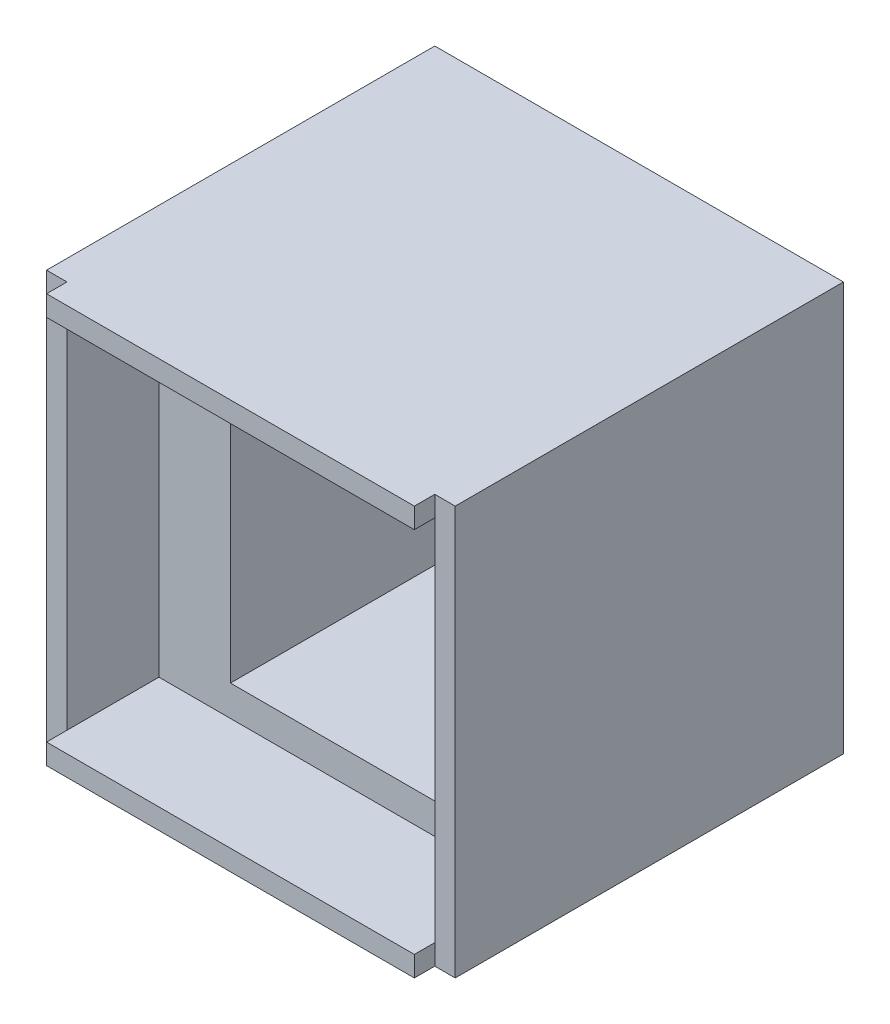
ISO-10303-21;
HEADER;
FILE_DESCRIPTION(('STEP AP214'),'2;1');
FILE_NAME('part.step','',(''),(''),'','','');
FILE_SCHEMA(('AUTOMOTIVE_DESIGN { 1 0 10303 214 1 1 1 1 }'));
ENDSEC;
DATA;
#1=APPLICATION_CONTEXT('core data for automotive mechanical design processes');
#2=APPLICATION_PROTOCOL_DEFINITION('international standard','automotive_design',2000,#1);
#3=PRODUCT_CONTEXT('',#1,'mechanical');
#4=PRODUCT('Part','Part','',(#3));
#5=PRODUCT_RELATED_PRODUCT_CATEGORY('part','',(#4));
#6=PRODUCT_DEFINITION_FORMATION('','',#4);
#7=PRODUCT_DEFINITION_CONTEXT('part definition',#1,'design');
#8=PRODUCT_DEFINITION('design','',#6,#7);
#9=PRODUCT_DEFINITION_SHAPE('','',#8);
#10=(LENGTH_UNIT() NAMED_UNIT(*) SI_UNIT(.MILLI.,.METRE.));
#11=(NAMED_UNIT(*) PLANE_ANGLE_UNIT() SI_UNIT($,.RADIAN.));
#12=(NAMED_UNIT(*) SI_UNIT($,.STERADIAN.) SOLID_ANGLE_UNIT());
#13=UNCERTAINTY_MEASURE_WITH_UNIT(LENGTH_MEASURE(1.E-05),#10,'distance_accuracy_value','');
#14=(GEOMETRIC_REPRESENTATION_CONTEXT(3) GLOBAL_UNCERTAINTY_ASSIGNED_CONTEXT((#13)) GLOBAL_UNIT_ASSIGNED_CONTEXT((#10,
#11,#12)) REPRESENTATION_CONTEXT('',''));
#15=CARTESIAN_POINT('',(0.,0.,0.));
#16=DIRECTION('',(0.,0.,1.));
#17=DIRECTION('',(1.,0.,0.));
#18=AXIS2_PLACEMENT_3D('',#15,#16,#17);
#19=CARTESIAN_POINT('',(0.,0.,200.));
#20=DIRECTION('',(0.,0.,1.));
#21=DIRECTION('',(1.,0.,0.));
#22=AXIS2_PLACEMENT_3D('',#19,#20,#21);
#23=PLANE('',#22);
#24=DIRECTION('',(1.,0.,0.));
#25=VECTOR('',#24,1.);
#26=CARTESIAN_POINT('',(0.,-90.,200.));
#27=LINE('',#26,#25);
#28=CARTESIAN_POINT('',(90.,-90.,200.));
#29=VERTEX_POINT('',#28);
#30=CARTESIAN_POINT('',(-90.,-90.,200.));
#31=VERTEX_POINT('',#30);
#32=EDGE_CURVE('E20',#29,#31,#27,.F.);
#33=ORIENTED_EDGE('',*,*,#32,.T.);
#34=DIRECTION('',(0.,1.,0.));
#35=VECTOR('',#34,1.);
#36=CARTESIAN_POINT('',(-90.,100.,200.));
#37=LINE('',#36,#35);
#38=CARTESIAN_POINT('',(-90.,-100.,200.));
#39=VERTEX_POINT('',#38);
#40=EDGE_CURVE('E146',#31,#39,#37,.F.);
#41=ORIENTED_EDGE('',*,*,#40,.T.);
#42=DIRECTION('',(1.,0.,0.));
#43=VECTOR('',#42,1.);
#44=CARTESIAN_POINT('',(-100.,-100.,200.));
#45=LINE('',#44,#43);
#46=CARTESIAN_POINT('',(90.,-100.,200.));
#47=VERTEX_POINT('',#46);
#48=EDGE_CURVE('E194',#39,#47,#45,.T.);
#49=ORIENTED_EDGE('',*,*,#48,.T.);
#50=DIRECTION('',(0.,1.,0.));
#51=VECTOR('',#50,1.);
#52=CARTESIAN_POINT('',(90.,100.,200.));
#53=LINE('',#52,#51);
#54=EDGE_CURVE('E148',#29,#47,#53,.F.);
#55=ORIENTED_EDGE('',*,*,#54,.F.);
#56=EDGE_LOOP('',(#33,#41,#49,#55));
#57=FACE_BOUND('',#56,.T.);
#58=ADVANCED_FACE('F17',(#57),#23,.T.);
#59=CARTESIAN_POINT('',(0.,-90.,145.));
#60=DIRECTION('',(0.,-1.,0.));
#61=DIRECTION('',(1.,0.,0.));
#62=AXIS2_PLACEMENT_3D('',#59,#60,#61);
#63=PLANE('',#62);
#64=DIRECTION('',(0.,0.,1.));
#65=VECTOR('',#64,1.);
#66=CARTESIAN_POINT('',(90.,-90.,190.));
#67=LINE('',#66,#65);
#68=CARTESIAN_POINT('',(90.,-90.,190.));
#69=VERTEX_POINT('',#68);
#70=EDGE_CURVE('E190',#69,#29,#67,.T.);
#71=ORIENTED_EDGE('',*,*,#70,.F.);
#72=DIRECTION('',(0.,0.,1.));
#73=VECTOR('',#72,1.);
#74=CARTESIAN_POINT('',(90.,-90.,145.));
#75=LINE('',#74,#73);
#76=CARTESIAN_POINT('',(90.,-90.,145.));
#77=VERTEX_POINT('',#76);
#78=EDGE_CURVE('E199',#77,#69,#75,.T.);
#79=ORIENTED_EDGE('',*,*,#78,.F.);
#80=DIRECTION('',(1.,0.,0.));
#81=VECTOR('',#80,1.);
#82=CARTESIAN_POINT('',(0.,-90.,145.));
#83=LINE('',#82,#81);
#84=CARTESIAN_POINT('',(-90.,-90.,145.));
#85=VERTEX_POINT('',#84);
#86=EDGE_CURVE('E139',#85,#77,#83,.T.);
#87=ORIENTED_EDGE('',*,*,#86,.F.);
#88=DIRECTION('',(0.,0.,1.));
#89=VECTOR('',#88,1.);
#90=CARTESIAN_POINT('',(-90.,-90.,145.));
#91=LINE('',#90,#89);
#92=CARTESIAN_POINT('',(-90.,-90.,190.));
#93=VERTEX_POINT('',#92);
#94=EDGE_CURVE('E162',#85,#93,#91,.T.);
#95=ORIENTED_EDGE('',*,*,#94,.T.);
#96=DIRECTION('',(0.,0.,1.));
#97=VECTOR('',#96,1.);
#98=CARTESIAN_POINT('',(-90.,-90.,190.));
#99=LINE('',#98,#97);
#100=EDGE_CURVE('E156',#93,#31,#99,.T.);
#101=ORIENTED_EDGE('',*,*,#100,.T.);
#102=ORIENTED_EDGE('',*,*,#32,.F.);
#103=EDGE_LOOP('',(#71,#79,#87,#95,#101,#102));
#104=FACE_BOUND('',#103,.T.);
#105=ADVANCED_FACE('F161',(#104),#63,.F.);
#106=CARTESIAN_POINT('',(0.,0.,145.));
#107=DIRECTION('',(0.,0.,1.));
#108=DIRECTION('',(1.,0.,0.));
#109=AXIS2_PLACEMENT_3D('',#106,#107,#108);
#110=PLANE('',#109);
#111=ORIENTED_EDGE('',*,*,#86,.T.);
#112=DIRECTION('',(0.,-1.,0.));
#113=VECTOR('',#112,1.);
#114=CARTESIAN_POINT('',(90.,0.,145.));
#115=LINE('',#114,#113);
#116=CARTESIAN_POINT('',(90.,90.,145.));
#117=VERTEX_POINT('',#116);
#118=EDGE_CURVE('E201',#117,#77,#115,.T.);
#119=ORIENTED_EDGE('',*,*,#118,.F.);
#120=DIRECTION('',(1.,0.,0.));
#121=VECTOR('',#120,1.);
#122=CARTESIAN_POINT('',(0.,90.,145.));
#123=LINE('',#122,#121);
#124=CARTESIAN_POINT('',(-90.,90.,145.));
#125=VERTEX_POINT('',#124);
#126=EDGE_CURVE('E207',#125,#117,#123,.T.);
#127=ORIENTED_EDGE('',*,*,#126,.F.);
#128=DIRECTION('',(0.,1.,0.));
#129=VECTOR('',#128,1.);
#130=CARTESIAN_POINT('',(-90.,0.,145.));
#131=LINE('',#130,#129);
#132=EDGE_CURVE('E159',#125,#85,#131,.F.);
#133=ORIENTED_EDGE('',*,*,#132,.T.);
#134=EDGE_LOOP('',(#111,#119,#127,#133));
#135=FACE_BOUND('',#134,.T.);
#136=DIRECTION('',(0.,-1.,0.));
#137=VECTOR('',#136,1.);
#138=CARTESIAN_POINT('',(-55.,75.,145.));
#139=LINE('',#138,#137);
#140=CARTESIAN_POINT('',(-55.,-75.,145.));
#141=VERTEX_POINT('',#140);
#142=CARTESIAN_POINT('',(-55.,75.,145.));
#143=VERTEX_POINT('',#142);
#144=EDGE_CURVE('E169',#141,#143,#139,.F.);
#145=ORIENTED_EDGE('',*,*,#144,.T.);
#146=DIRECTION('',(1.,0.,0.));
#147=VECTOR('',#146,1.);
#148=CARTESIAN_POINT('',(55.,75.,145.));
#149=LINE('',#148,#147);
#150=CARTESIAN_POINT('',(55.,75.,145.));
#151=VERTEX_POINT('',#150);
#152=EDGE_CURVE('E174',#143,#151,#149,.T.);
#153=ORIENTED_EDGE('',*,*,#152,.T.);
#154=DIRECTION('',(0.,1.,0.));
#155=VECTOR('',#154,1.);
#156=CARTESIAN_POINT('',(55.,-75.,145.));
#157=LINE('',#156,#155);
#158=CARTESIAN_POINT('',(55.,-75.,145.));
#159=VERTEX_POINT('',#158);
#160=EDGE_CURVE('E179',#151,#159,#157,.F.);
#161=ORIENTED_EDGE('',*,*,#160,.T.);
#162=DIRECTION('',(1.,0.,0.));
#163=VECTOR('',#162,1.);
#164=CARTESIAN_POINT('',(-55.,-75.,145.));
#165=LINE('',#164,#163);
#166=EDGE_CURVE('E187',#159,#141,#165,.F.);
#167=ORIENTED_EDGE('',*,*,#166,.T.);
#168=EDGE_LOOP('',(#145,#153,#161,#167));
#169=FACE_BOUND('',#168,.T.);
#170=ADVANCED_FACE('F383',(#135,#169),#110,.T.);
#171=CARTESIAN_POINT('',(-90.,100.,190.));
#172=DIRECTION('',(1.,0.,0.));
#173=DIRECTION('',(0.,1.,0.));
#174=AXIS2_PLACEMENT_3D('',#171,#172,#173);
#175=PLANE('',#174);
#176=DIRECTION('',(0.,0.,1.));
#177=VECTOR('',#176,1.);
#178=CARTESIAN_POINT('',(-90.,-100.,200.));
#179=LINE('',#178,#177);
#180=CARTESIAN_POINT('',(-90.,-100.,190.));
#181=VERTEX_POINT('',#180);
#182=EDGE_CURVE('E158',#181,#39,#179,.T.);
#183=ORIENTED_EDGE('',*,*,#182,.T.);
#184=ORIENTED_EDGE('',*,*,#40,.F.);
#185=ORIENTED_EDGE('',*,*,#100,.F.);
#186=DIRECTION('',(0.,1.,0.));
#187=VECTOR('',#186,1.);
#188=CARTESIAN_POINT('',(-90.,0.,190.));
#189=LINE('',#188,#187);
#190=EDGE_CURVE('E219',#181,#93,#189,.T.);
#191=ORIENTED_EDGE('',*,*,#190,.F.);
#192=EDGE_LOOP('',(#183,#184,#185,#191));
#193=FACE_BOUND('',#192,.T.);
#194=ADVANCED_FACE('F154',(#193),#175,.F.);
#195=CARTESIAN_POINT('',(-90.,0.,145.));
#196=DIRECTION('',(-1.,0.,0.));
#197=DIRECTION('',(0.,0.,1.));
#198=AXIS2_PLACEMENT_3D('',#195,#196,#197);
#199=PLANE('',#198);
#200=ORIENTED_EDGE('',*,*,#94,.F.);
#201=ORIENTED_EDGE('',*,*,#132,.F.);
#202=DIRECTION('',(0.,0.,-1.));
#203=VECTOR('',#202,1.);
#204=CARTESIAN_POINT('',(-90.,90.,145.));
#205=LINE('',#204,#203);
#206=CARTESIAN_POINT('',(-90.,90.,190.));
#207=VERTEX_POINT('',#206);
#208=EDGE_CURVE('E204',#207,#125,#205,.T.);
#209=ORIENTED_EDGE('',*,*,#208,.F.);
#210=DIRECTION('',(0.,1.,0.));
#211=VECTOR('',#210,1.);
#212=CARTESIAN_POINT('',(-90.,0.,190.));
#213=LINE('',#212,#211);
#214=EDGE_CURVE('E221',#93,#207,#213,.T.);
#215=ORIENTED_EDGE('',*,*,#214,.F.);
#216=EDGE_LOOP('',(#200,#201,#209,#215));
#217=FACE_BOUND('',#216,.T.);
#218=ADVANCED_FACE('F376',(#217),#199,.F.);
#219=CARTESIAN_POINT('',(-55.,75.,0.));
#220=DIRECTION('',(-1.,0.,0.));
#221=DIRECTION('',(0.,-1.,0.));
#222=AXIS2_PLACEMENT_3D('',#219,#220,#221);
#223=PLANE('',#222);
#224=DIRECTION('',(0.,0.,-1.));
#225=VECTOR('',#224,1.);
#226=CARTESIAN_POINT('',(-55.,-75.,0.));
#227=LINE('',#226,#225);
#228=CARTESIAN_POINT('',(-55.,-75.,0.));
#229=VERTEX_POINT('',#228);
#230=EDGE_CURVE('E181',#141,#229,#227,.T.);
#231=ORIENTED_EDGE('',*,*,#230,.T.);
#232=DIRECTION('',(0.,1.,0.));
#233=VECTOR('',#232,1.);
#234=CARTESIAN_POINT('',(-55.,0.,0.));
#235=LINE('',#234,#233);
#236=CARTESIAN_POINT('',(-55.,75.,0.));
#237=VERTEX_POINT('',#236);
#238=EDGE_CURVE('E234',#229,#237,#235,.T.);
#239=ORIENTED_EDGE('',*,*,#238,.T.);
#240=DIRECTION('',(0.,0.,1.));
#241=VECTOR('',#240,1.);
#242=CARTESIAN_POINT('',(-55.,75.,0.));
#243=LINE('',#242,#241);
#244=EDGE_CURVE('E171',#237,#143,#243,.T.);
#245=ORIENTED_EDGE('',*,*,#244,.T.);
#246=ORIENTED_EDGE('',*,*,#144,.F.);
#247=EDGE_LOOP('',(#231,#239,#245,#246));
#248=FACE_BOUND('',#247,.T.);
#249=ADVANCED_FACE('F372',(#248),#223,.F.);
#250=CARTESIAN_POINT('',(55.,75.,0.));
#251=DIRECTION('',(0.,1.,0.));
#252=DIRECTION('',(0.,0.,1.));
#253=AXIS2_PLACEMENT_3D('',#250,#251,#252);
#254=PLANE('',#253);
#255=ORIENTED_EDGE('',*,*,#244,.F.);
#256=DIRECTION('',(1.,0.,0.));
#257=VECTOR('',#256,1.);
#258=CARTESIAN_POINT('',(0.,75.,0.));
#259=LINE('',#258,#257);
#260=CARTESIAN_POINT('',(55.,75.,0.));
#261=VERTEX_POINT('',#260);
#262=EDGE_CURVE('E237',#237,#261,#259,.T.);
#263=ORIENTED_EDGE('',*,*,#262,.T.);
#264=DIRECTION('',(0.,0.,1.));
#265=VECTOR('',#264,1.);
#266=CARTESIAN_POINT('',(55.,75.,0.));
#267=LINE('',#266,#265);
#268=EDGE_CURVE('E176',#261,#151,#267,.T.);
#269=ORIENTED_EDGE('',*,*,#268,.T.);
#270=ORIENTED_EDGE('',*,*,#152,.F.);
#271=EDGE_LOOP('',(#255,#263,#269,#270));
#272=FACE_BOUND('',#271,.T.);
#273=ADVANCED_FACE('F368',(#272),#254,.F.);
#274=CARTESIAN_POINT('',(55.,-75.,0.));
#275=DIRECTION('',(1.,0.,0.));
#276=DIRECTION('',(0.,1.,0.));
#277=AXIS2_PLACEMENT_3D('',#274,#275,#276);
#278=PLANE('',#277);
#279=ORIENTED_EDGE('',*,*,#268,.F.);
#280=DIRECTION('',(0.,1.,0.));
#281=VECTOR('',#280,1.);
#282=CARTESIAN_POINT('',(55.,0.,0.));
#283=LINE('',#282,#281);
#284=CARTESIAN_POINT('',(55.,-75.,0.));
#285=VERTEX_POINT('',#284);
#286=EDGE_CURVE('E240',#261,#285,#283,.F.);
#287=ORIENTED_EDGE('',*,*,#286,.T.);
#288=DIRECTION('',(0.,0.,-1.));
#289=VECTOR('',#288,1.);
#290=CARTESIAN_POINT('',(55.,-75.,0.));
#291=LINE('',#290,#289);
#292=EDGE_CURVE('E184',#285,#159,#291,.F.);
#293=ORIENTED_EDGE('',*,*,#292,.T.);
#294=ORIENTED_EDGE('',*,*,#160,.F.);
#295=EDGE_LOOP('',(#279,#287,#293,#294));
#296=FACE_BOUND('',#295,.T.);
#297=ADVANCED_FACE('F364',(#296),#278,.F.);
#298=CARTESIAN_POINT('',(-55.,-75.,0.));
#299=DIRECTION('',(0.,-1.,0.));
#300=DIRECTION('',(0.,0.,-1.));
#301=AXIS2_PLACEMENT_3D('',#298,#299,#300);
#302=PLANE('',#301);
#303=ORIENTED_EDGE('',*,*,#292,.F.);
#304=DIRECTION('',(1.,0.,0.));
#305=VECTOR('',#304,1.);
#306=CARTESIAN_POINT('',(0.,-75.,0.));
#307=LINE('',#306,#305);
#308=EDGE_CURVE('E243',#285,#229,#307,.F.);
#309=ORIENTED_EDGE('',*,*,#308,.T.);
#310=ORIENTED_EDGE('',*,*,#230,.F.);
#311=ORIENTED_EDGE('',*,*,#166,.F.);
#312=EDGE_LOOP('',(#303,#309,#310,#311));
#313=FACE_BOUND('',#312,.T.);
#314=ADVANCED_FACE('F360',(#313),#302,.F.);
#315=CARTESIAN_POINT('',(90.,100.,190.));
#316=DIRECTION('',(1.,0.,0.));
#317=DIRECTION('',(0.,1.,0.));
#318=AXIS2_PLACEMENT_3D('',#315,#316,#317);
#319=PLANE('',#318);
#320=DIRECTION('',(0.,0.,1.));
#321=VECTOR('',#320,1.);
#322=CARTESIAN_POINT('',(90.,-100.,200.));
#323=LINE('',#322,#321);
#324=CARTESIAN_POINT('',(90.,-100.,190.));
#325=VERTEX_POINT('',#324);
#326=EDGE_CURVE('E196',#47,#325,#323,.F.);
#327=ORIENTED_EDGE('',*,*,#326,.T.);
#328=DIRECTION('',(0.,1.,0.));
#329=VECTOR('',#328,1.);
#330=CARTESIAN_POINT('',(90.,0.,190.));
#331=LINE('',#330,#329);
#332=EDGE_CURVE('E257',#69,#325,#331,.F.);
#333=ORIENTED_EDGE('',*,*,#332,.F.);
#334=ORIENTED_EDGE('',*,*,#70,.T.);
#335=ORIENTED_EDGE('',*,*,#54,.T.);
#336=EDGE_LOOP('',(#327,#333,#334,#335));
#337=FACE_BOUND('',#336,.T.);
#338=ADVANCED_FACE('F356',(#337),#319,.T.);
#339=CARTESIAN_POINT('',(-100.,-100.,200.));
#340=DIRECTION('',(0.,1.,0.));
#341=DIRECTION('',(0.,0.,1.));
#342=AXIS2_PLACEMENT_3D('',#339,#340,#341);
#343=PLANE('',#342);
#344=ORIENTED_EDGE('',*,*,#48,.F.);
#345=ORIENTED_EDGE('',*,*,#182,.F.);
#346=DIRECTION('',(1.,0.,0.));
#347=VECTOR('',#346,1.);
#348=CARTESIAN_POINT('',(0.,-100.,190.));
#349=LINE('',#348,#347);
#350=CARTESIAN_POINT('',(-100.,-100.,190.));
#351=VERTEX_POINT('',#350);
#352=EDGE_CURVE('E226',#351,#181,#349,.T.);
#353=ORIENTED_EDGE('',*,*,#352,.F.);
#354=DIRECTION('',(0.,0.,1.));
#355=VECTOR('',#354,1.);
#356=CARTESIAN_POINT('',(-100.,-100.,200.));
#357=LINE('',#356,#355);
#358=CARTESIAN_POINT('',(-100.,-100.,0.));
#359=VERTEX_POINT('',#358);
#360=EDGE_CURVE('E229',#351,#359,#357,.F.);
#361=ORIENTED_EDGE('',*,*,#360,.T.);
#362=DIRECTION('',(1.,0.,0.));
#363=VECTOR('',#362,1.);
#364=CARTESIAN_POINT('',(0.,-100.,0.));
#365=LINE('',#364,#363);
#366=CARTESIAN_POINT('',(100.,-100.,0.));
#367=VERTEX_POINT('',#366);
#368=EDGE_CURVE('E249',#359,#367,#365,.T.);
#369=ORIENTED_EDGE('',*,*,#368,.T.);
#370=DIRECTION('',(0.,0.,1.));
#371=VECTOR('',#370,1.);
#372=CARTESIAN_POINT('',(100.,-100.,200.));
#373=LINE('',#372,#371);
#374=CARTESIAN_POINT('',(100.,-100.,190.));
#375=VERTEX_POINT('',#374);
#376=EDGE_CURVE('E254',#367,#375,#373,.T.);
#377=ORIENTED_EDGE('',*,*,#376,.T.);
#378=DIRECTION('',(1.,0.,0.));
#379=VECTOR('',#378,1.);
#380=CARTESIAN_POINT('',(0.,-100.,190.));
#381=LINE('',#380,#379);
#382=EDGE_CURVE('E259',#325,#375,#381,.T.);
#383=ORIENTED_EDGE('',*,*,#382,.F.);
#384=ORIENTED_EDGE('',*,*,#326,.F.);
#385=EDGE_LOOP('',(#344,#345,#353,#361,#369,#377,#383,#384));
#386=FACE_BOUND('',#385,.T.);
#387=ADVANCED_FACE('F352',(#386),#343,.F.);
#388=CARTESIAN_POINT('',(90.,0.,145.));
#389=DIRECTION('',(-1.,0.,0.));
#390=DIRECTION('',(0.,-1.,0.));
#391=AXIS2_PLACEMENT_3D('',#388,#389,#390);
#392=PLANE('',#391);
#393=DIRECTION('',(0.,0.,-1.));
#394=VECTOR('',#393,1.);
#395=CARTESIAN_POINT('',(90.,90.,145.));
#396=LINE('',#395,#394);
#397=CARTESIAN_POINT('',(90.,90.,190.));
#398=VERTEX_POINT('',#397);
#399=EDGE_CURVE('E209',#117,#398,#396,.F.);
#400=ORIENTED_EDGE('',*,*,#399,.F.);
#401=ORIENTED_EDGE('',*,*,#118,.T.);
#402=ORIENTED_EDGE('',*,*,#78,.T.);
#403=DIRECTION('',(0.,1.,0.));
#404=VECTOR('',#403,1.);
#405=CARTESIAN_POINT('',(90.,0.,190.));
#406=LINE('',#405,#404);
#407=EDGE_CURVE('E263',#398,#69,#406,.F.);
#408=ORIENTED_EDGE('',*,*,#407,.F.);
#409=EDGE_LOOP('',(#400,#401,#402,#408));
#410=FACE_BOUND('',#409,.T.);
#411=ADVANCED_FACE('F348',(#410),#392,.T.);
#412=CARTESIAN_POINT('',(0.,90.,145.));
#413=DIRECTION('',(0.,-1.,0.));
#414=DIRECTION('',(0.,0.,-1.));
#415=AXIS2_PLACEMENT_3D('',#412,#413,#414);
#416=PLANE('',#415);
#417=ORIENTED_EDGE('',*,*,#399,.T.);
#418=DIRECTION('',(0.,0.,1.));
#419=VECTOR('',#418,1.);
#420=CARTESIAN_POINT('',(90.,90.,190.));
#421=LINE('',#420,#419);
#422=CARTESIAN_POINT('',(90.,90.,200.));
#423=VERTEX_POINT('',#422);
#424=EDGE_CURVE('E270',#423,#398,#421,.F.);
#425=ORIENTED_EDGE('',*,*,#424,.F.);
#426=DIRECTION('',(1.,0.,0.));
#427=VECTOR('',#426,1.);
#428=CARTESIAN_POINT('',(0.,90.,200.));
#429=LINE('',#428,#427);
#430=CARTESIAN_POINT('',(-90.,90.,200.));
#431=VERTEX_POINT('',#430);
#432=EDGE_CURVE('E211',#431,#423,#429,.T.);
#433=ORIENTED_EDGE('',*,*,#432,.F.);
#434=DIRECTION('',(0.,0.,1.));
#435=VECTOR('',#434,1.);
#436=CARTESIAN_POINT('',(-90.,90.,190.));
#437=LINE('',#436,#435);
#438=EDGE_CURVE('E216',#431,#207,#437,.F.);
#439=ORIENTED_EDGE('',*,*,#438,.T.);
#440=ORIENTED_EDGE('',*,*,#208,.T.);
#441=ORIENTED_EDGE('',*,*,#126,.T.);
#442=EDGE_LOOP('',(#417,#425,#433,#439,#440,#441));
#443=FACE_BOUND('',#442,.T.);
#444=ADVANCED_FACE('F345',(#443),#416,.T.);
#445=CARTESIAN_POINT('',(0.,0.,200.));
#446=DIRECTION('',(0.,0.,1.));
#447=DIRECTION('',(1.,0.,0.));
#448=AXIS2_PLACEMENT_3D('',#445,#446,#447);
#449=PLANE('',#448);
#450=DIRECTION('',(1.,0.,0.));
#451=VECTOR('',#450,1.);
#452=CARTESIAN_POINT('',(-100.,100.,200.));
#453=LINE('',#452,#451);
#454=CARTESIAN_POINT('',(90.,100.,200.));
#455=VERTEX_POINT('',#454);
#456=CARTESIAN_POINT('',(-90.,100.,200.));
#457=VERTEX_POINT('',#456);
#458=EDGE_CURVE('E272',#455,#457,#453,.F.);
#459=ORIENTED_EDGE('',*,*,#458,.T.);
#460=DIRECTION('',(0.,1.,0.));
#461=VECTOR('',#460,1.);
#462=CARTESIAN_POINT('',(-90.,100.,200.));
#463=LINE('',#462,#461);
#464=EDGE_CURVE('E213',#457,#431,#463,.F.);
#465=ORIENTED_EDGE('',*,*,#464,.T.);
#466=ORIENTED_EDGE('',*,*,#432,.T.);
#467=DIRECTION('',(0.,1.,0.));
#468=VECTOR('',#467,1.);
#469=CARTESIAN_POINT('',(90.,100.,200.));
#470=LINE('',#469,#468);
#471=EDGE_CURVE('E267',#455,#423,#470,.F.);
#472=ORIENTED_EDGE('',*,*,#471,.F.);
#473=EDGE_LOOP('',(#459,#465,#466,#472));
#474=FACE_BOUND('',#473,.T.);
#475=ADVANCED_FACE('F319',(#474),#449,.T.);
#476=CARTESIAN_POINT('',(-90.,100.,190.));
#477=DIRECTION('',(1.,0.,0.));
#478=DIRECTION('',(0.,1.,0.));
#479=AXIS2_PLACEMENT_3D('',#476,#477,#478);
#480=PLANE('',#479);
#481=ORIENTED_EDGE('',*,*,#464,.F.);
#482=DIRECTION('',(0.,0.,-1.));
#483=VECTOR('',#482,1.);
#484=CARTESIAN_POINT('',(-90.,100.,200.));
#485=LINE('',#484,#483);
#486=CARTESIAN_POINT('',(-90.,100.,190.));
#487=VERTEX_POINT('',#486);
#488=EDGE_CURVE('E275',#457,#487,#485,.T.);
#489=ORIENTED_EDGE('',*,*,#488,.T.);
#490=DIRECTION('',(0.,1.,0.));
#491=VECTOR('',#490,1.);
#492=CARTESIAN_POINT('',(-90.,0.,190.));
#493=LINE('',#492,#491);
#494=EDGE_CURVE('E224',#207,#487,#493,.T.);
#495=ORIENTED_EDGE('',*,*,#494,.F.);
#496=ORIENTED_EDGE('',*,*,#438,.F.);
#497=EDGE_LOOP('',(#481,#489,#495,#496));
#498=FACE_BOUND('',#497,.T.);
#499=ADVANCED_FACE('F316',(#498),#480,.F.);
#500=CARTESIAN_POINT('',(0.,0.,190.));
#501=DIRECTION('',(0.,0.,1.));
#502=DIRECTION('',(1.,0.,0.));
#503=AXIS2_PLACEMENT_3D('',#500,#501,#502);
#504=PLANE('',#503);
#505=DIRECTION('',(0.,1.,0.));
#506=VECTOR('',#505,1.);
#507=CARTESIAN_POINT('',(-100.,100.,190.));
#508=LINE('',#507,#506);
#509=CARTESIAN_POINT('',(-100.,100.,190.));
#510=VERTEX_POINT('',#509);
#511=EDGE_CURVE('E231',#510,#351,#508,.F.);
#512=ORIENTED_EDGE('',*,*,#511,.T.);
#513=ORIENTED_EDGE('',*,*,#352,.T.);
#514=ORIENTED_EDGE('',*,*,#190,.T.);
#515=ORIENTED_EDGE('',*,*,#214,.T.);
#516=ORIENTED_EDGE('',*,*,#494,.T.);
#517=DIRECTION('',(1.,0.,0.));
#518=VECTOR('',#517,1.);
#519=CARTESIAN_POINT('',(-100.,100.,190.));
#520=LINE('',#519,#518);
#521=EDGE_CURVE('E278',#487,#510,#520,.F.);
#522=ORIENTED_EDGE('',*,*,#521,.T.);
#523=EDGE_LOOP('',(#512,#513,#514,#515,#516,#522));
#524=FACE_BOUND('',#523,.T.);
#525=ADVANCED_FACE('F312',(#524),#504,.T.);
#526=CARTESIAN_POINT('',(-100.,100.,200.));
#527=DIRECTION('',(1.,0.,0.));
#528=DIRECTION('',(0.,1.,0.));
#529=AXIS2_PLACEMENT_3D('',#526,#527,#528);
#530=PLANE('',#529);
#531=DIRECTION('',(0.,0.,-1.));
#532=VECTOR('',#531,1.);
#533=CARTESIAN_POINT('',(-100.,100.,200.));
#534=LINE('',#533,#532);
#535=CARTESIAN_POINT('',(-100.,100.,0.));
#536=VERTEX_POINT('',#535);
#537=EDGE_CURVE('E281',#510,#536,#534,.T.);
#538=ORIENTED_EDGE('',*,*,#537,.T.);
#539=DIRECTION('',(0.,1.,0.));
#540=VECTOR('',#539,1.);
#541=CARTESIAN_POINT('',(-100.,0.,0.));
#542=LINE('',#541,#540);
#543=EDGE_CURVE('E246',#536,#359,#542,.F.);
#544=ORIENTED_EDGE('',*,*,#543,.T.);
#545=ORIENTED_EDGE('',*,*,#360,.F.);
#546=ORIENTED_EDGE('',*,*,#511,.F.);
#547=EDGE_LOOP('',(#538,#544,#545,#546));
#548=FACE_BOUND('',#547,.T.);
#549=ADVANCED_FACE('F309',(#548),#530,.F.);
#550=CARTESIAN_POINT('',(0.,0.,0.));
#551=DIRECTION('',(0.,0.,1.));
#552=DIRECTION('',(1.,0.,0.));
#553=AXIS2_PLACEMENT_3D('',#550,#551,#552);
#554=PLANE('',#553);
#555=ORIENTED_EDGE('',*,*,#368,.F.);
#556=ORIENTED_EDGE('',*,*,#543,.F.);
#557=DIRECTION('',(1.,0.,0.));
#558=VECTOR('',#557,1.);
#559=CARTESIAN_POINT('',(-100.,100.,0.));
#560=LINE('',#559,#558);
#561=CARTESIAN_POINT('',(100.,100.,0.));
#562=VERTEX_POINT('',#561);
#563=EDGE_CURVE('E284',#536,#562,#560,.T.);
#564=ORIENTED_EDGE('',*,*,#563,.T.);
#565=DIRECTION('',(0.,-1.,0.));
#566=VECTOR('',#565,1.);
#567=CARTESIAN_POINT('',(100.,100.,0.));
#568=LINE('',#567,#566);
#569=EDGE_CURVE('E251',#562,#367,#568,.T.);
#570=ORIENTED_EDGE('',*,*,#569,.T.);
#571=EDGE_LOOP('',(#555,#556,#564,#570));
#572=FACE_BOUND('',#571,.T.);
#573=ORIENTED_EDGE('',*,*,#286,.F.);
#574=ORIENTED_EDGE('',*,*,#262,.F.);
#575=ORIENTED_EDGE('',*,*,#238,.F.);
#576=ORIENTED_EDGE('',*,*,#308,.F.);
#577=EDGE_LOOP('',(#573,#574,#575,#576));
#578=FACE_BOUND('',#577,.T.);
#579=ADVANCED_FACE('F304',(#572,#578),#554,.F.);
#580=CARTESIAN_POINT('',(100.,100.,200.));
#581=DIRECTION('',(-1.,0.,0.));
#582=DIRECTION('',(0.,-1.,0.));
#583=AXIS2_PLACEMENT_3D('',#580,#581,#582);
#584=PLANE('',#583);
#585=ORIENTED_EDGE('',*,*,#376,.F.);
#586=ORIENTED_EDGE('',*,*,#569,.F.);
#587=DIRECTION('',(0.,0.,-1.));
#588=VECTOR('',#587,1.);
#589=CARTESIAN_POINT('',(100.,100.,200.));
#590=LINE('',#589,#588);
#591=CARTESIAN_POINT('',(100.,100.,190.));
#592=VERTEX_POINT('',#591);
#593=EDGE_CURVE('E287',#562,#592,#590,.F.);
#594=ORIENTED_EDGE('',*,*,#593,.T.);
#595=DIRECTION('',(0.,1.,0.));
#596=VECTOR('',#595,1.);
#597=CARTESIAN_POINT('',(100.,0.,190.));
#598=LINE('',#597,#596);
#599=EDGE_CURVE('E261',#375,#592,#598,.T.);
#600=ORIENTED_EDGE('',*,*,#599,.F.);
#601=EDGE_LOOP('',(#585,#586,#594,#600));
#602=FACE_BOUND('',#601,.T.);
#603=ADVANCED_FACE('F301',(#602),#584,.F.);
#604=CARTESIAN_POINT('',(0.,0.,190.));
#605=DIRECTION('',(0.,0.,1.));
#606=DIRECTION('',(1.,0.,0.));
#607=AXIS2_PLACEMENT_3D('',#604,#605,#606);
#608=PLANE('',#607);
#609=DIRECTION('',(0.,1.,0.));
#610=VECTOR('',#609,1.);
#611=CARTESIAN_POINT('',(90.,100.,190.));
#612=LINE('',#611,#610);
#613=CARTESIAN_POINT('',(90.,100.,190.));
#614=VERTEX_POINT('',#613);
#615=EDGE_CURVE('E34',#398,#614,#612,.T.);
#616=ORIENTED_EDGE('',*,*,#615,.F.);
#617=ORIENTED_EDGE('',*,*,#407,.T.);
#618=ORIENTED_EDGE('',*,*,#332,.T.);
#619=ORIENTED_EDGE('',*,*,#382,.T.);
#620=ORIENTED_EDGE('',*,*,#599,.T.);
#621=DIRECTION('',(1.,0.,0.));
#622=VECTOR('',#621,1.);
#623=CARTESIAN_POINT('',(-100.,100.,190.));
#624=LINE('',#623,#622);
#625=EDGE_CURVE('E26',#592,#614,#624,.F.);
#626=ORIENTED_EDGE('',*,*,#625,.T.);
#627=EDGE_LOOP('',(#616,#617,#618,#619,#620,#626));
#628=FACE_BOUND('',#627,.T.);
#629=ADVANCED_FACE('F293',(#628),#608,.T.);
#630=CARTESIAN_POINT('',(90.,100.,190.));
#631=DIRECTION('',(1.,0.,0.));
#632=DIRECTION('',(0.,1.,0.));
#633=AXIS2_PLACEMENT_3D('',#630,#631,#632);
#634=PLANE('',#633);
#635=ORIENTED_EDGE('',*,*,#471,.T.);
#636=ORIENTED_EDGE('',*,*,#424,.T.);
#637=ORIENTED_EDGE('',*,*,#615,.T.);
#638=DIRECTION('',(0.,0.,-1.));
#639=VECTOR('',#638,1.);
#640=CARTESIAN_POINT('',(90.,100.,200.));
#641=LINE('',#640,#639);
#642=EDGE_CURVE('E11',#614,#455,#641,.F.);
#643=ORIENTED_EDGE('',*,*,#642,.T.);
#644=EDGE_LOOP('',(#635,#636,#637,#643));
#645=FACE_BOUND('',#644,.T.);
#646=ADVANCED_FACE('F322',(#645),#634,.T.);
#647=CARTESIAN_POINT('',(-100.,100.,200.));
#648=DIRECTION('',(0.,-1.,0.));
#649=DIRECTION('',(0.,0.,-1.));
#650=AXIS2_PLACEMENT_3D('',#647,#648,#649);
#651=PLANE('',#650);
#652=ORIENTED_EDGE('',*,*,#625,.F.);
#653=ORIENTED_EDGE('',*,*,#593,.F.);
#654=ORIENTED_EDGE('',*,*,#563,.F.);
#655=ORIENTED_EDGE('',*,*,#537,.F.);
#656=ORIENTED_EDGE('',*,*,#521,.F.);
#657=ORIENTED_EDGE('',*,*,#488,.F.);
#658=ORIENTED_EDGE('',*,*,#458,.F.);
#659=ORIENTED_EDGE('',*,*,#642,.F.);
#660=EDGE_LOOP('',(#652,#653,#654,#655,#656,#657,#658,#659));
#661=FACE_BOUND('',#660,.T.);
#662=ADVANCED_FACE('F297',(#661),#651,.F.);
#663=CLOSED_SHELL('',(#58,#105,#170,#194,#218,#249,#273,#297,#314,#338,#387,#411,#444,#475,#499,
#525,#549,#579,#603,#629,#646,#662));
#664=MANIFOLD_SOLID_BREP('B1',#663);
#665=ADVANCED_BREP_SHAPE_REPRESENTATION('',(#18,#664),#14);
#666=SHAPE_DEFINITION_REPRESENTATION(#9,#665);
ENDSEC;
END-ISO-10303-21;
